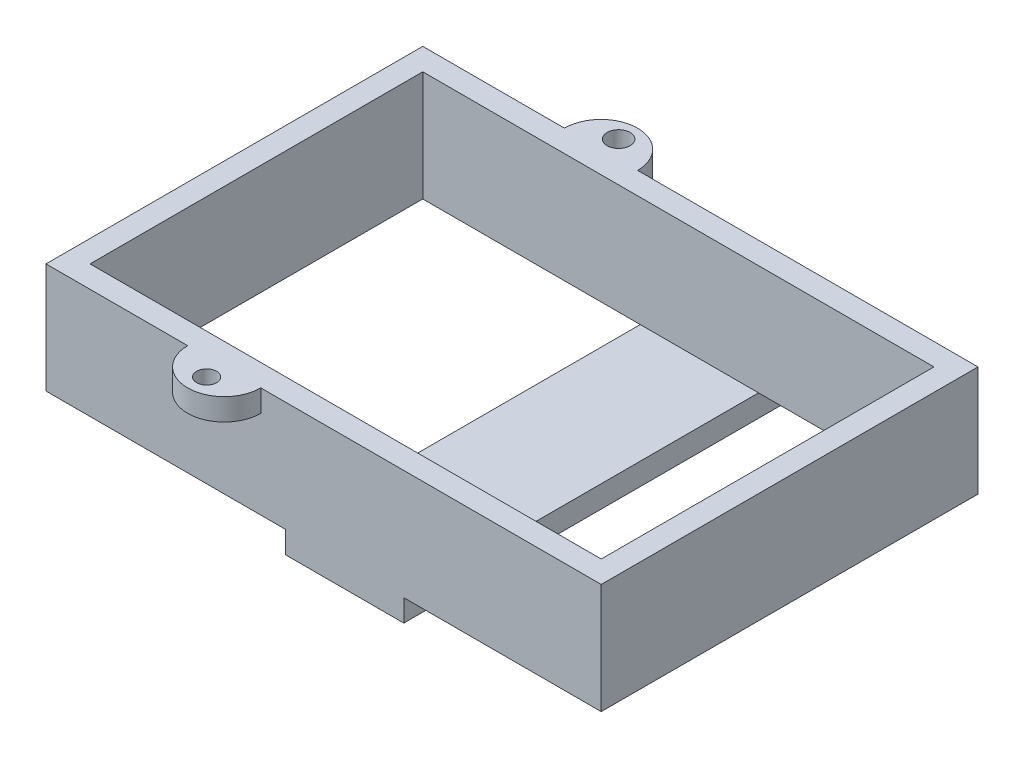
ISO-10303-21;
HEADER;
FILE_DESCRIPTION(('STEP AP214'),'2;1');
FILE_NAME('part.step','',(''),(''),'','','');
FILE_SCHEMA(('AUTOMOTIVE_DESIGN { 1 0 10303 214 1 1 1 1 }'));
ENDSEC;
DATA;
#1=APPLICATION_CONTEXT('core data for automotive mechanical design processes');
#2=APPLICATION_PROTOCOL_DEFINITION('international standard','automotive_design',2000,#1);
#3=PRODUCT_CONTEXT('',#1,'mechanical');
#4=PRODUCT('Part','Part','',(#3));
#5=PRODUCT_RELATED_PRODUCT_CATEGORY('part','',(#4));
#6=PRODUCT_DEFINITION_FORMATION('','',#4);
#7=PRODUCT_DEFINITION_CONTEXT('part definition',#1,'design');
#8=PRODUCT_DEFINITION('design','',#6,#7);
#9=PRODUCT_DEFINITION_SHAPE('','',#8);
#10=(LENGTH_UNIT() NAMED_UNIT(*) SI_UNIT(.MILLI.,.METRE.));
#11=(NAMED_UNIT(*) PLANE_ANGLE_UNIT() SI_UNIT($,.RADIAN.));
#12=(NAMED_UNIT(*) SI_UNIT($,.STERADIAN.) SOLID_ANGLE_UNIT());
#13=UNCERTAINTY_MEASURE_WITH_UNIT(LENGTH_MEASURE(1.E-05),#10,'distance_accuracy_value','');
#14=(GEOMETRIC_REPRESENTATION_CONTEXT(3) GLOBAL_UNCERTAINTY_ASSIGNED_CONTEXT((#13)) GLOBAL_UNIT_ASSIGNED_CONTEXT((#10,
#11,#12)) REPRESENTATION_CONTEXT('',''));
#15=CARTESIAN_POINT('',(0.,0.,0.));
#16=DIRECTION('',(0.,0.,1.));
#17=DIRECTION('',(1.,0.,0.));
#18=AXIS2_PLACEMENT_3D('',#15,#16,#17);
#19=CARTESIAN_POINT('',(-34.5888235294118,-12.7,21.9336470588235));
#20=DIRECTION('',(0.,0.,1.));
#21=DIRECTION('',(1.,0.,0.));
#22=AXIS2_PLACEMENT_3D('',#19,#20,#21);
#23=PLANE('',#22);
#24=DIRECTION('',(1.,0.,0.));
#25=VECTOR('',#24,1.);
#26=CARTESIAN_POINT('',(-34.5888235294118,0.,21.9336470588235));
#27=LINE('',#26,#25);
#28=CARTESIAN_POINT('',(-9.82382352941177,0.,21.9336470588235));
#29=VERTEX_POINT('',#28);
#30=CARTESIAN_POINT('',(29.4191764705882,0.,21.9336470588235));
#31=VERTEX_POINT('',#30);
#32=EDGE_CURVE('E177',#29,#31,#27,.T.);
#33=ORIENTED_EDGE('',*,*,#32,.F.);
#34=DIRECTION('',(0.,1.,0.));
#35=VECTOR('',#34,1.);
#36=CARTESIAN_POINT('',(-9.82382352941177,-2.54,21.9336470588235));
#37=LINE('',#36,#35);
#38=CARTESIAN_POINT('',(-9.82382352941177,-2.54,21.9336470588235));
#39=VERTEX_POINT('',#38);
#40=EDGE_CURVE('E168',#39,#29,#37,.T.);
#41=ORIENTED_EDGE('',*,*,#40,.F.);
#42=DIRECTION('',(1.,0.,0.));
#43=VECTOR('',#42,1.);
#44=CARTESIAN_POINT('',(0.,-2.54,21.9336470588235));
#45=LINE('',#44,#43);
#46=CARTESIAN_POINT('',(-18.2559175655999,-2.54,21.9336470588235));
#47=VERTEX_POINT('',#46);
#48=EDGE_CURVE('E160',#47,#39,#45,.T.);
#49=ORIENTED_EDGE('',*,*,#48,.F.);
#50=DIRECTION('',(0.,1.,0.));
#51=VECTOR('',#50,1.);
#52=CARTESIAN_POINT('',(-18.2559175655999,-2.54,21.9336470588235));
#53=LINE('',#52,#51);
#54=CARTESIAN_POINT('',(-18.2559175655999,0.,21.9336470588235));
#55=VERTEX_POINT('',#54);
#56=EDGE_CURVE('E173',#47,#55,#53,.T.);
#57=ORIENTED_EDGE('',*,*,#56,.T.);
#58=CARTESIAN_POINT('',(-34.5888235294118,0.,21.9336470588235));
#59=VERTEX_POINT('',#58);
#60=EDGE_CURVE('E291',#59,#55,#27,.T.);
#61=ORIENTED_EDGE('',*,*,#60,.F.);
#62=DIRECTION('',(0.,1.,0.));
#63=VECTOR('',#62,1.);
#64=CARTESIAN_POINT('',(-34.5888235294118,-12.7,21.9336470588235));
#65=LINE('',#64,#63);
#66=CARTESIAN_POINT('',(-34.5888235294118,-12.7,21.9336470588235));
#67=VERTEX_POINT('',#66);
#68=EDGE_CURVE('E304',#67,#59,#65,.T.);
#69=ORIENTED_EDGE('',*,*,#68,.F.);
#70=DIRECTION('',(1.,0.,0.));
#71=VECTOR('',#70,1.);
#72=CARTESIAN_POINT('',(-34.5888235294118,-12.7,21.9336470588235));
#73=LINE('',#72,#71);
#74=CARTESIAN_POINT('',(-6.9775294117647,-12.7,21.9336470588235));
#75=VERTEX_POINT('',#74);
#76=EDGE_CURVE('E279',#67,#75,#73,.T.);
#77=ORIENTED_EDGE('',*,*,#76,.T.);
#78=DIRECTION('',(0.,1.,0.));
#79=VECTOR('',#78,1.);
#80=CARTESIAN_POINT('',(-6.9775294117647,-15.24,21.9336470588235));
#81=LINE('',#80,#79);
#82=CARTESIAN_POINT('',(-6.9775294117647,-15.24,21.9336470588235));
#83=VERTEX_POINT('',#82);
#84=EDGE_CURVE('E232',#83,#75,#81,.T.);
#85=ORIENTED_EDGE('',*,*,#84,.F.);
#86=DIRECTION('',(-1.,0.,0.));
#87=VECTOR('',#86,1.);
#88=CARTESIAN_POINT('',(6.66077647058824,-15.24,21.9336470588235));
#89=LINE('',#88,#87);
#90=CARTESIAN_POINT('',(6.66077647058824,-15.24,21.9336470588235));
#91=VERTEX_POINT('',#90);
#92=EDGE_CURVE('E202',#91,#83,#89,.T.);
#93=ORIENTED_EDGE('',*,*,#92,.F.);
#94=DIRECTION('',(0.,1.,0.));
#95=VECTOR('',#94,1.);
#96=CARTESIAN_POINT('',(6.66077647058824,-15.24,21.9336470588235));
#97=LINE('',#96,#95);
#98=CARTESIAN_POINT('',(6.66077647058824,-12.7,21.9336470588235));
#99=VERTEX_POINT('',#98);
#100=EDGE_CURVE('E235',#91,#99,#97,.T.);
#101=ORIENTED_EDGE('',*,*,#100,.T.);
#102=CARTESIAN_POINT('',(29.4191764705882,-12.7,21.9336470588235));
#103=VERTEX_POINT('',#102);
#104=EDGE_CURVE('E270',#99,#103,#73,.T.);
#105=ORIENTED_EDGE('',*,*,#104,.T.);
#106=DIRECTION('',(0.,1.,0.));
#107=VECTOR('',#106,1.);
#108=CARTESIAN_POINT('',(29.4191764705882,-12.7,21.9336470588235));
#109=LINE('',#108,#107);
#110=EDGE_CURVE('E303',#103,#31,#109,.T.);
#111=ORIENTED_EDGE('',*,*,#110,.T.);
#112=EDGE_LOOP('',(#33,#41,#49,#57,#61,#69,#77,#85,#93,#101,#105,#111));
#113=FACE_BOUND('',#112,.T.);
#114=ADVANCED_FACE('F35',(#113),#23,.T.);
#115=CARTESIAN_POINT('',(-34.5888235294118,-12.7,-21.5003529411765));
#116=DIRECTION('',(0.,0.,-1.));
#117=DIRECTION('',(-1.,0.,0.));
#118=AXIS2_PLACEMENT_3D('',#115,#116,#117);
#119=PLANE('',#118);
#120=DIRECTION('',(-1.,0.,0.));
#121=VECTOR('',#120,1.);
#122=CARTESIAN_POINT('',(-34.5888235294118,0.,-21.5003529411765));
#123=LINE('',#122,#121);
#124=CARTESIAN_POINT('',(-18.2559175655999,0.,-21.5003529411765));
#125=VERTEX_POINT('',#124);
#126=CARTESIAN_POINT('',(-34.5888235294118,0.,-21.5003529411765));
#127=VERTEX_POINT('',#126);
#128=EDGE_CURVE('E296',#125,#127,#123,.T.);
#129=ORIENTED_EDGE('',*,*,#128,.F.);
#130=DIRECTION('',(0.,1.,0.));
#131=VECTOR('',#130,1.);
#132=CARTESIAN_POINT('',(-18.2559175655999,-2.54,-21.5003529411765));
#133=LINE('',#132,#131);
#134=CARTESIAN_POINT('',(-18.2559175655999,-2.54,-21.5003529411765));
#135=VERTEX_POINT('',#134);
#136=EDGE_CURVE('E190',#135,#125,#133,.T.);
#137=ORIENTED_EDGE('',*,*,#136,.F.);
#138=DIRECTION('',(-1.,0.,0.));
#139=VECTOR('',#138,1.);
#140=CARTESIAN_POINT('',(0.,-2.54,-21.5003529411765));
#141=LINE('',#140,#139);
#142=CARTESIAN_POINT('',(-9.82382352941177,-2.54,-21.5003529411765));
#143=VERTEX_POINT('',#142);
#144=EDGE_CURVE('E188',#143,#135,#141,.T.);
#145=ORIENTED_EDGE('',*,*,#144,.F.);
#146=DIRECTION('',(0.,1.,0.));
#147=VECTOR('',#146,1.);
#148=CARTESIAN_POINT('',(-9.82382352941177,-2.54,-21.5003529411765));
#149=LINE('',#148,#147);
#150=CARTESIAN_POINT('',(-9.82382352941177,0.,-21.5003529411765));
#151=VERTEX_POINT('',#150);
#152=EDGE_CURVE('E194',#143,#151,#149,.T.);
#153=ORIENTED_EDGE('',*,*,#152,.T.);
#154=CARTESIAN_POINT('',(29.4191764705882,0.,-21.5003529411765));
#155=VERTEX_POINT('',#154);
#156=EDGE_CURVE('E271',#155,#151,#123,.T.);
#157=ORIENTED_EDGE('',*,*,#156,.F.);
#158=DIRECTION('',(0.,1.,0.));
#159=VECTOR('',#158,1.);
#160=CARTESIAN_POINT('',(29.4191764705882,-12.7,-21.5003529411765));
#161=LINE('',#160,#159);
#162=CARTESIAN_POINT('',(29.4191764705882,-12.7,-21.5003529411765));
#163=VERTEX_POINT('',#162);
#164=EDGE_CURVE('E301',#163,#155,#161,.T.);
#165=ORIENTED_EDGE('',*,*,#164,.F.);
#166=DIRECTION('',(-1.,0.,0.));
#167=VECTOR('',#166,1.);
#168=CARTESIAN_POINT('',(-34.5888235294118,-12.7,-21.5003529411765));
#169=LINE('',#168,#167);
#170=CARTESIAN_POINT('',(6.66077647058824,-12.7,-21.5003529411765));
#171=VERTEX_POINT('',#170);
#172=EDGE_CURVE('E284',#163,#171,#169,.T.);
#173=ORIENTED_EDGE('',*,*,#172,.T.);
#174=DIRECTION('',(0.,1.,0.));
#175=VECTOR('',#174,1.);
#176=CARTESIAN_POINT('',(6.66077647058824,-15.24,-21.5003529411765));
#177=LINE('',#176,#175);
#178=CARTESIAN_POINT('',(6.66077647058824,-15.24,-21.5003529411765));
#179=VERTEX_POINT('',#178);
#180=EDGE_CURVE('E209',#179,#171,#177,.T.);
#181=ORIENTED_EDGE('',*,*,#180,.F.);
#182=DIRECTION('',(1.,0.,0.));
#183=VECTOR('',#182,1.);
#184=CARTESIAN_POINT('',(6.66077647058824,-15.24,-21.5003529411765));
#185=LINE('',#184,#183);
#186=CARTESIAN_POINT('',(-6.9775294117647,-15.24,-21.5003529411765));
#187=VERTEX_POINT('',#186);
#188=EDGE_CURVE('E207',#187,#179,#185,.T.);
#189=ORIENTED_EDGE('',*,*,#188,.F.);
#190=DIRECTION('',(0.,1.,0.));
#191=VECTOR('',#190,1.);
#192=CARTESIAN_POINT('',(-6.9775294117647,-15.24,-21.5003529411765));
#193=LINE('',#192,#191);
#194=CARTESIAN_POINT('',(-6.9775294117647,-12.7,-21.5003529411765));
#195=VERTEX_POINT('',#194);
#196=EDGE_CURVE('E227',#187,#195,#193,.T.);
#197=ORIENTED_EDGE('',*,*,#196,.T.);
#198=CARTESIAN_POINT('',(-34.5888235294118,-12.7,-21.5003529411765));
#199=VERTEX_POINT('',#198);
#200=EDGE_CURVE('E282',#195,#199,#169,.T.);
#201=ORIENTED_EDGE('',*,*,#200,.T.);
#202=DIRECTION('',(0.,1.,0.));
#203=VECTOR('',#202,1.);
#204=CARTESIAN_POINT('',(-34.5888235294118,-12.7,-21.5003529411765));
#205=LINE('',#204,#203);
#206=EDGE_CURVE('E298',#199,#127,#205,.T.);
#207=ORIENTED_EDGE('',*,*,#206,.T.);
#208=EDGE_LOOP('',(#129,#137,#145,#153,#157,#165,#173,#181,#189,#197,#201,#207));
#209=FACE_BOUND('',#208,.T.);
#210=ADVANCED_FACE('F313',(#209),#119,.T.);
#211=CARTESIAN_POINT('',(0.,-12.7,0.));
#212=DIRECTION('',(0.,1.,0.));
#213=DIRECTION('',(0.,0.,1.));
#214=AXIS2_PLACEMENT_3D('',#211,#212,#213);
#215=PLANE('',#214);
#216=DIRECTION('',(0.,0.,1.));
#217=VECTOR('',#216,1.);
#218=CARTESIAN_POINT('',(6.66077647058824,-12.7,21.9336470588235));
#219=LINE('',#218,#217);
#220=CARTESIAN_POINT('',(6.66077647058824,-12.7,-18.9603529411765));
#221=VERTEX_POINT('',#220);
#222=EDGE_CURVE('E213',#171,#221,#219,.T.);
#223=ORIENTED_EDGE('',*,*,#222,.F.);
#224=ORIENTED_EDGE('',*,*,#172,.F.);
#225=DIRECTION('',(0.,0.,-1.));
#226=VECTOR('',#225,1.);
#227=CARTESIAN_POINT('',(29.4191764705882,-12.7,-21.5003529411765));
#228=LINE('',#227,#226);
#229=EDGE_CURVE('E274',#103,#163,#228,.T.);
#230=ORIENTED_EDGE('',*,*,#229,.F.);
#231=ORIENTED_EDGE('',*,*,#104,.F.);
#232=CARTESIAN_POINT('',(6.66077647058823,-12.7,19.3936470588235));
#233=VERTEX_POINT('',#232);
#234=EDGE_CURVE('E11',#233,#99,#219,.T.);
#235=ORIENTED_EDGE('',*,*,#234,.F.);
#236=DIRECTION('',(1.,0.,0.));
#237=VECTOR('',#236,1.);
#238=CARTESIAN_POINT('',(-32.0488235294118,-12.7,19.3936470588235));
#239=LINE('',#238,#237);
#240=CARTESIAN_POINT('',(26.8791764705882,-12.7,19.3936470588235));
#241=VERTEX_POINT('',#240);
#242=EDGE_CURVE('E371',#233,#241,#239,.T.);
#243=ORIENTED_EDGE('',*,*,#242,.T.);
#244=DIRECTION('',(0.,0.,-1.));
#245=VECTOR('',#244,1.);
#246=CARTESIAN_POINT('',(26.8791764705882,-12.7,-18.9603529411765));
#247=LINE('',#246,#245);
#248=CARTESIAN_POINT('',(26.8791764705882,-12.7,-18.9603529411765));
#249=VERTEX_POINT('',#248);
#250=EDGE_CURVE('E348',#241,#249,#247,.T.);
#251=ORIENTED_EDGE('',*,*,#250,.T.);
#252=DIRECTION('',(-1.,0.,0.));
#253=VECTOR('',#252,1.);
#254=CARTESIAN_POINT('',(-32.0488235294118,-12.7,-18.9603529411765));
#255=LINE('',#254,#253);
#256=EDGE_CURVE('E249',#249,#221,#255,.T.);
#257=ORIENTED_EDGE('',*,*,#256,.T.);
#258=EDGE_LOOP('',(#223,#224,#230,#231,#235,#243,#251,#257));
#259=FACE_BOUND('',#258,.T.);
#260=ADVANCED_FACE('F354',(#259),#215,.F.);
#261=DIRECTION('',(0.,0.,-1.));
#262=VECTOR('',#261,1.);
#263=CARTESIAN_POINT('',(-6.9775294117647,-12.7,21.9336470588235));
#264=LINE('',#263,#262);
#265=CARTESIAN_POINT('',(-6.9775294117647,-12.7,19.3936470588235));
#266=VERTEX_POINT('',#265);
#267=EDGE_CURVE('E203',#75,#266,#264,.T.);
#268=ORIENTED_EDGE('',*,*,#267,.F.);
#269=ORIENTED_EDGE('',*,*,#76,.F.);
#270=DIRECTION('',(0.,0.,1.));
#271=VECTOR('',#270,1.);
#272=CARTESIAN_POINT('',(-34.5888235294118,-12.7,-21.5003529411765));
#273=LINE('',#272,#271);
#274=EDGE_CURVE('E267',#199,#67,#273,.T.);
#275=ORIENTED_EDGE('',*,*,#274,.F.);
#276=ORIENTED_EDGE('',*,*,#200,.F.);
#277=CARTESIAN_POINT('',(-6.9775294117647,-12.7,-18.9603529411765));
#278=VERTEX_POINT('',#277);
#279=EDGE_CURVE('E44',#278,#195,#264,.T.);
#280=ORIENTED_EDGE('',*,*,#279,.F.);
#281=CARTESIAN_POINT('',(-32.0488235294118,-12.7,-18.9603529411765));
#282=VERTEX_POINT('',#281);
#283=EDGE_CURVE('E338',#278,#282,#255,.T.);
#284=ORIENTED_EDGE('',*,*,#283,.T.);
#285=DIRECTION('',(0.,0.,1.));
#286=VECTOR('',#285,1.);
#287=CARTESIAN_POINT('',(-32.0488235294118,-12.7,-18.9603529411765));
#288=LINE('',#287,#286);
#289=CARTESIAN_POINT('',(-32.0488235294118,-12.7,19.3936470588235));
#290=VERTEX_POINT('',#289);
#291=EDGE_CURVE('E257',#282,#290,#288,.T.);
#292=ORIENTED_EDGE('',*,*,#291,.T.);
#293=EDGE_CURVE('E369',#290,#266,#239,.T.);
#294=ORIENTED_EDGE('',*,*,#293,.T.);
#295=EDGE_LOOP('',(#268,#269,#275,#276,#280,#284,#292,#294));
#296=FACE_BOUND('',#295,.T.);
#297=ADVANCED_FACE('F336',(#296),#215,.F.);
#298=CARTESIAN_POINT('',(-34.5888235294118,-12.7,-21.5003529411765));
#299=DIRECTION('',(-1.,0.,0.));
#300=DIRECTION('',(0.,0.,1.));
#301=AXIS2_PLACEMENT_3D('',#298,#299,#300);
#302=PLANE('',#301);
#303=DIRECTION('',(0.,0.,1.));
#304=VECTOR('',#303,1.);
#305=CARTESIAN_POINT('',(-34.5888235294118,0.,-21.5003529411765));
#306=LINE('',#305,#304);
#307=EDGE_CURVE('E260',#127,#59,#306,.T.);
#308=ORIENTED_EDGE('',*,*,#307,.F.);
#309=ORIENTED_EDGE('',*,*,#206,.F.);
#310=ORIENTED_EDGE('',*,*,#274,.T.);
#311=ORIENTED_EDGE('',*,*,#68,.T.);
#312=EDGE_LOOP('',(#308,#309,#310,#311));
#313=FACE_BOUND('',#312,.T.);
#314=ADVANCED_FACE('F37',(#313),#302,.T.);
#315=CARTESIAN_POINT('',(29.4191764705882,-12.7,-21.5003529411765));
#316=DIRECTION('',(1.,0.,0.));
#317=DIRECTION('',(0.,0.,-1.));
#318=AXIS2_PLACEMENT_3D('',#315,#316,#317);
#319=PLANE('',#318);
#320=DIRECTION('',(0.,0.,-1.));
#321=VECTOR('',#320,1.);
#322=CARTESIAN_POINT('',(29.4191764705882,0.,-21.5003529411765));
#323=LINE('',#322,#321);
#324=EDGE_CURVE('E293',#31,#155,#323,.T.);
#325=ORIENTED_EDGE('',*,*,#324,.F.);
#326=ORIENTED_EDGE('',*,*,#110,.F.);
#327=ORIENTED_EDGE('',*,*,#229,.T.);
#328=ORIENTED_EDGE('',*,*,#164,.T.);
#329=EDGE_LOOP('',(#325,#326,#327,#328));
#330=FACE_BOUND('',#329,.T.);
#331=ADVANCED_FACE('F377',(#330),#319,.T.);
#332=CARTESIAN_POINT('',(0.,0.,0.));
#333=DIRECTION('',(0.,1.,0.));
#334=DIRECTION('',(0.,0.,1.));
#335=AXIS2_PLACEMENT_3D('',#332,#333,#334);
#336=PLANE('',#335);
#337=DIRECTION('',(0.,0.,1.));
#338=VECTOR('',#337,1.);
#339=CARTESIAN_POINT('',(-32.0488235294118,0.,-18.9603529411765));
#340=LINE('',#339,#338);
#341=CARTESIAN_POINT('',(-32.0488235294118,0.,-18.9603529411765));
#342=VERTEX_POINT('',#341);
#343=CARTESIAN_POINT('',(-32.0488235294118,0.,19.3936470588235));
#344=VERTEX_POINT('',#343);
#345=EDGE_CURVE('E238',#342,#344,#340,.T.);
#346=ORIENTED_EDGE('',*,*,#345,.F.);
#347=DIRECTION('',(-1.,0.,0.));
#348=VECTOR('',#347,1.);
#349=CARTESIAN_POINT('',(-32.0488235294118,0.,-18.9603529411765));
#350=LINE('',#349,#348);
#351=CARTESIAN_POINT('',(26.8791764705882,0.,-18.9603529411765));
#352=VERTEX_POINT('',#351);
#353=EDGE_CURVE('E254',#352,#342,#350,.T.);
#354=ORIENTED_EDGE('',*,*,#353,.F.);
#355=DIRECTION('',(0.,0.,-1.));
#356=VECTOR('',#355,1.);
#357=CARTESIAN_POINT('',(26.8791764705882,0.,-18.9603529411765));
#358=LINE('',#357,#356);
#359=CARTESIAN_POINT('',(26.8791764705882,0.,19.3936470588235));
#360=VERTEX_POINT('',#359);
#361=EDGE_CURVE('E246',#360,#352,#358,.T.);
#362=ORIENTED_EDGE('',*,*,#361,.F.);
#363=DIRECTION('',(1.,0.,0.));
#364=VECTOR('',#363,1.);
#365=CARTESIAN_POINT('',(-32.0488235294118,0.,19.3936470588235));
#366=LINE('',#365,#364);
#367=EDGE_CURVE('E240',#344,#360,#366,.T.);
#368=ORIENTED_EDGE('',*,*,#367,.F.);
#369=EDGE_LOOP('',(#346,#354,#362,#368));
#370=FACE_BOUND('',#369,.T.);
#371=ORIENTED_EDGE('',*,*,#307,.T.);
#372=ORIENTED_EDGE('',*,*,#60,.T.);
#373=CARTESIAN_POINT('',(-14.0398705475059,0.,21.9336470588235));
#374=DIRECTION('',(0.,1.,0.));
#375=DIRECTION('',(0.,0.,1.));
#376=AXIS2_PLACEMENT_3D('',#373,#374,#375);
#377=CIRCLE('',#376,4.21604701809409);
#378=EDGE_CURVE('E52',#29,#55,#377,.F.);
#379=ORIENTED_EDGE('',*,*,#378,.F.);
#380=ORIENTED_EDGE('',*,*,#32,.T.);
#381=ORIENTED_EDGE('',*,*,#324,.T.);
#382=ORIENTED_EDGE('',*,*,#156,.T.);
#383=CARTESIAN_POINT('',(-14.0398705475059,0.,-21.5003529411765));
#384=DIRECTION('',(0.,1.,0.));
#385=DIRECTION('',(0.,0.,1.));
#386=AXIS2_PLACEMENT_3D('',#383,#384,#385);
#387=CIRCLE('',#386,4.21604701809409);
#388=EDGE_CURVE('E59',#125,#151,#387,.F.);
#389=ORIENTED_EDGE('',*,*,#388,.F.);
#390=ORIENTED_EDGE('',*,*,#128,.T.);
#391=EDGE_LOOP('',(#371,#372,#379,#380,#381,#382,#389,#390));
#392=FACE_BOUND('',#391,.T.);
#393=CARTESIAN_POINT('',(-14.0398705475059,0.,-23.5323529411765));
#394=DIRECTION('',(0.,1.,0.));
#395=DIRECTION('',(0.,0.,1.));
#396=AXIS2_PLACEMENT_3D('',#393,#394,#395);
#397=CIRCLE('',#396,1.327962252747);
#398=CARTESIAN_POINT('',(-14.0398705475059,0.,-22.2043906884295));
#399=VERTEX_POINT('',#398);
#400=EDGE_CURVE('E179',#399,#399,#397,.T.);
#401=ORIENTED_EDGE('',*,*,#400,.F.);
#402=EDGE_LOOP('',(#401));
#403=FACE_BOUND('',#402,.T.);
#404=CARTESIAN_POINT('',(-14.0398705475059,0.,23.9656470588235));
#405=DIRECTION('',(0.,1.,0.));
#406=DIRECTION('',(0.,0.,1.));
#407=AXIS2_PLACEMENT_3D('',#404,#405,#406);
#408=CIRCLE('',#407,1.1466599070348);
#409=CARTESIAN_POINT('',(-14.0398705475059,0.,25.1123069658583));
#410=VERTEX_POINT('',#409);
#411=EDGE_CURVE('E441',#410,#410,#408,.T.);
#412=ORIENTED_EDGE('',*,*,#411,.F.);
#413=EDGE_LOOP('',(#412));
#414=FACE_BOUND('',#413,.T.);
#415=ADVANCED_FACE('F363',(#370,#392,#403,#414),#336,.T.);
#416=CARTESIAN_POINT('',(-32.0488235294118,-12.7,-18.9603529411765));
#417=DIRECTION('',(-1.,0.,0.));
#418=DIRECTION('',(0.,0.,1.));
#419=AXIS2_PLACEMENT_3D('',#416,#417,#418);
#420=PLANE('',#419);
#421=ORIENTED_EDGE('',*,*,#345,.T.);
#422=DIRECTION('',(0.,1.,0.));
#423=VECTOR('',#422,1.);
#424=CARTESIAN_POINT('',(-32.0488235294118,-12.7,19.3936470588235));
#425=LINE('',#424,#423);
#426=EDGE_CURVE('E265',#290,#344,#425,.T.);
#427=ORIENTED_EDGE('',*,*,#426,.F.);
#428=ORIENTED_EDGE('',*,*,#291,.F.);
#429=DIRECTION('',(0.,1.,0.));
#430=VECTOR('',#429,1.);
#431=CARTESIAN_POINT('',(-32.0488235294118,-12.7,-18.9603529411765));
#432=LINE('',#431,#430);
#433=EDGE_CURVE('E258',#282,#342,#432,.T.);
#434=ORIENTED_EDGE('',*,*,#433,.T.);
#435=EDGE_LOOP('',(#421,#427,#428,#434));
#436=FACE_BOUND('',#435,.T.);
#437=ADVANCED_FACE('F370',(#436),#420,.F.);
#438=CARTESIAN_POINT('',(-32.0488235294118,-12.7,-18.9603529411765));
#439=DIRECTION('',(0.,0.,-1.));
#440=DIRECTION('',(-1.,0.,0.));
#441=AXIS2_PLACEMENT_3D('',#438,#439,#440);
#442=PLANE('',#441);
#443=ORIENTED_EDGE('',*,*,#353,.T.);
#444=ORIENTED_EDGE('',*,*,#433,.F.);
#445=ORIENTED_EDGE('',*,*,#283,.F.);
#446=EDGE_CURVE('E345',#221,#278,#255,.T.);
#447=ORIENTED_EDGE('',*,*,#446,.F.);
#448=ORIENTED_EDGE('',*,*,#256,.F.);
#449=DIRECTION('',(0.,1.,0.));
#450=VECTOR('',#449,1.);
#451=CARTESIAN_POINT('',(26.8791764705882,-12.7,-18.9603529411765));
#452=LINE('',#451,#450);
#453=EDGE_CURVE('E261',#249,#352,#452,.T.);
#454=ORIENTED_EDGE('',*,*,#453,.T.);
#455=EDGE_LOOP('',(#443,#444,#445,#447,#448,#454));
#456=FACE_BOUND('',#455,.T.);
#457=ADVANCED_FACE('F343',(#456),#442,.F.);
#458=CARTESIAN_POINT('',(26.8791764705882,-12.7,-18.9603529411765));
#459=DIRECTION('',(1.,0.,0.));
#460=DIRECTION('',(0.,0.,-1.));
#461=AXIS2_PLACEMENT_3D('',#458,#459,#460);
#462=PLANE('',#461);
#463=ORIENTED_EDGE('',*,*,#361,.T.);
#464=ORIENTED_EDGE('',*,*,#453,.F.);
#465=ORIENTED_EDGE('',*,*,#250,.F.);
#466=DIRECTION('',(0.,1.,0.));
#467=VECTOR('',#466,1.);
#468=CARTESIAN_POINT('',(26.8791764705882,-12.7,19.3936470588235));
#469=LINE('',#468,#467);
#470=EDGE_CURVE('E263',#241,#360,#469,.T.);
#471=ORIENTED_EDGE('',*,*,#470,.T.);
#472=EDGE_LOOP('',(#463,#464,#465,#471));
#473=FACE_BOUND('',#472,.T.);
#474=ADVANCED_FACE('F359',(#473),#462,.F.);
#475=CARTESIAN_POINT('',(-32.0488235294118,-12.7,19.3936470588235));
#476=DIRECTION('',(0.,0.,1.));
#477=DIRECTION('',(1.,0.,0.));
#478=AXIS2_PLACEMENT_3D('',#475,#476,#477);
#479=PLANE('',#478);
#480=ORIENTED_EDGE('',*,*,#367,.T.);
#481=ORIENTED_EDGE('',*,*,#470,.F.);
#482=ORIENTED_EDGE('',*,*,#242,.F.);
#483=EDGE_CURVE('E372',#266,#233,#239,.T.);
#484=ORIENTED_EDGE('',*,*,#483,.F.);
#485=ORIENTED_EDGE('',*,*,#293,.F.);
#486=ORIENTED_EDGE('',*,*,#426,.T.);
#487=EDGE_LOOP('',(#480,#481,#482,#484,#485,#486));
#488=FACE_BOUND('',#487,.T.);
#489=ADVANCED_FACE('F365',(#488),#479,.F.);
#490=CARTESIAN_POINT('',(6.66077647058824,-15.24,21.9336470588235));
#491=DIRECTION('',(-1.,0.,0.));
#492=DIRECTION('',(0.,0.,1.));
#493=AXIS2_PLACEMENT_3D('',#490,#491,#492);
#494=PLANE('',#493);
#495=ORIENTED_EDGE('',*,*,#222,.T.);
#496=EDGE_CURVE('E197',#221,#233,#219,.T.);
#497=ORIENTED_EDGE('',*,*,#496,.T.);
#498=ORIENTED_EDGE('',*,*,#234,.T.);
#499=ORIENTED_EDGE('',*,*,#100,.F.);
#500=DIRECTION('',(0.,0.,1.));
#501=VECTOR('',#500,1.);
#502=CARTESIAN_POINT('',(6.66077647058824,-15.24,21.9336470588235));
#503=LINE('',#502,#501);
#504=EDGE_CURVE('E199',#179,#91,#503,.T.);
#505=ORIENTED_EDGE('',*,*,#504,.F.);
#506=ORIENTED_EDGE('',*,*,#180,.T.);
#507=EDGE_LOOP('',(#495,#497,#498,#499,#505,#506));
#508=FACE_BOUND('',#507,.T.);
#509=ADVANCED_FACE('F321',(#508),#494,.F.);
#510=CARTESIAN_POINT('',(-6.9775294117647,-15.24,21.9336470588235));
#511=DIRECTION('',(1.,0.,0.));
#512=DIRECTION('',(0.,0.,-1.));
#513=AXIS2_PLACEMENT_3D('',#510,#511,#512);
#514=PLANE('',#513);
#515=ORIENTED_EDGE('',*,*,#267,.T.);
#516=EDGE_CURVE('E214',#266,#278,#264,.T.);
#517=ORIENTED_EDGE('',*,*,#516,.T.);
#518=ORIENTED_EDGE('',*,*,#279,.T.);
#519=ORIENTED_EDGE('',*,*,#196,.F.);
#520=DIRECTION('',(0.,0.,-1.));
#521=VECTOR('',#520,1.);
#522=CARTESIAN_POINT('',(-6.9775294117647,-15.24,21.9336470588235));
#523=LINE('',#522,#521);
#524=EDGE_CURVE('E205',#83,#187,#523,.T.);
#525=ORIENTED_EDGE('',*,*,#524,.F.);
#526=ORIENTED_EDGE('',*,*,#84,.T.);
#527=EDGE_LOOP('',(#515,#517,#518,#519,#525,#526));
#528=FACE_BOUND('',#527,.T.);
#529=ADVANCED_FACE('F331',(#528),#514,.F.);
#530=CARTESIAN_POINT('',(0.,-15.24,0.));
#531=DIRECTION('',(0.,1.,0.));
#532=DIRECTION('',(0.,0.,1.));
#533=AXIS2_PLACEMENT_3D('',#530,#531,#532);
#534=PLANE('',#533);
#535=ORIENTED_EDGE('',*,*,#504,.T.);
#536=ORIENTED_EDGE('',*,*,#92,.T.);
#537=ORIENTED_EDGE('',*,*,#524,.T.);
#538=ORIENTED_EDGE('',*,*,#188,.T.);
#539=EDGE_LOOP('',(#535,#536,#537,#538));
#540=FACE_BOUND('',#539,.T.);
#541=ADVANCED_FACE('F323',(#540),#534,.F.);
#542=CARTESIAN_POINT('',(0.,-12.7,0.));
#543=DIRECTION('',(0.,1.,0.));
#544=DIRECTION('',(0.,0.,1.));
#545=AXIS2_PLACEMENT_3D('',#542,#543,#544);
#546=PLANE('',#545);
#547=ORIENTED_EDGE('',*,*,#496,.F.);
#548=ORIENTED_EDGE('',*,*,#446,.T.);
#549=ORIENTED_EDGE('',*,*,#516,.F.);
#550=ORIENTED_EDGE('',*,*,#483,.T.);
#551=EDGE_LOOP('',(#547,#548,#549,#550));
#552=FACE_BOUND('',#551,.T.);
#553=ADVANCED_FACE('F351',(#552),#546,.T.);
#554=CARTESIAN_POINT('',(-14.0398705475059,-2.54,-21.5003529411765));
#555=DIRECTION('',(0.,1.,0.));
#556=DIRECTION('',(0.,0.,1.));
#557=AXIS2_PLACEMENT_3D('',#554,#555,#556);
#558=CYLINDRICAL_SURFACE('',#557,4.21604701809409);
#559=ORIENTED_EDGE('',*,*,#388,.T.);
#560=ORIENTED_EDGE('',*,*,#152,.F.);
#561=CARTESIAN_POINT('',(-14.0398705475059,-2.54,-21.5003529411765));
#562=DIRECTION('',(0.,1.,0.));
#563=DIRECTION('',(0.,0.,1.));
#564=AXIS2_PLACEMENT_3D('',#561,#562,#563);
#565=CIRCLE('',#564,4.21604701809409);
#566=EDGE_CURVE('E186',#135,#143,#565,.F.);
#567=ORIENTED_EDGE('',*,*,#566,.F.);
#568=ORIENTED_EDGE('',*,*,#136,.T.);
#569=EDGE_LOOP('',(#559,#560,#567,#568));
#570=FACE_BOUND('',#569,.T.);
#571=ADVANCED_FACE('F384',(#570),#558,.T.);
#572=CARTESIAN_POINT('',(-14.0398705475059,-2.54,-23.5323529411765));
#573=DIRECTION('',(0.,1.,0.));
#574=DIRECTION('',(0.,0.,1.));
#575=AXIS2_PLACEMENT_3D('',#572,#573,#574);
#576=CYLINDRICAL_SURFACE('',#575,1.327962252747);
#577=CARTESIAN_POINT('',(-14.0398705475059,-2.54,-23.5323529411765));
#578=DIRECTION('',(0.,1.,0.));
#579=DIRECTION('',(0.,0.,1.));
#580=AXIS2_PLACEMENT_3D('',#577,#578,#579);
#581=CIRCLE('',#580,1.327962252747);
#582=CARTESIAN_POINT('',(-14.0398705475059,-2.54,-22.2043906884295));
#583=VERTEX_POINT('',#582);
#584=EDGE_CURVE('E183',#583,#583,#581,.T.);
#585=ORIENTED_EDGE('',*,*,#584,.F.);
#586=EDGE_LOOP('',(#585));
#587=FACE_BOUND('',#586,.T.);
#588=ORIENTED_EDGE('',*,*,#400,.T.);
#589=EDGE_LOOP('',(#588));
#590=FACE_BOUND('',#589,.T.);
#591=ADVANCED_FACE('F418',(#587,#590),#576,.F.);
#592=CARTESIAN_POINT('',(0.,-2.54,0.));
#593=DIRECTION('',(0.,1.,0.));
#594=DIRECTION('',(0.,0.,1.));
#595=AXIS2_PLACEMENT_3D('',#592,#593,#594);
#596=PLANE('',#595);
#597=ORIENTED_EDGE('',*,*,#584,.T.);
#598=EDGE_LOOP('',(#597));
#599=FACE_BOUND('',#598,.T.);
#600=ORIENTED_EDGE('',*,*,#566,.T.);
#601=ORIENTED_EDGE('',*,*,#144,.T.);
#602=EDGE_LOOP('',(#600,#601));
#603=FACE_BOUND('',#602,.T.);
#604=ADVANCED_FACE('F421',(#599,#603),#596,.F.);
#605=CARTESIAN_POINT('',(-14.0398705475059,-2.54,21.9336470588235));
#606=DIRECTION('',(0.,1.,0.));
#607=DIRECTION('',(0.,0.,1.));
#608=AXIS2_PLACEMENT_3D('',#605,#606,#607);
#609=CYLINDRICAL_SURFACE('',#608,4.21604701809409);
#610=ORIENTED_EDGE('',*,*,#378,.T.);
#611=ORIENTED_EDGE('',*,*,#56,.F.);
#612=CARTESIAN_POINT('',(-14.0398705475059,-2.54,21.9336470588235));
#613=DIRECTION('',(0.,1.,0.));
#614=DIRECTION('',(0.,0.,1.));
#615=AXIS2_PLACEMENT_3D('',#612,#613,#614);
#616=CIRCLE('',#615,4.21604701809409);
#617=EDGE_CURVE('E163',#39,#47,#616,.F.);
#618=ORIENTED_EDGE('',*,*,#617,.F.);
#619=ORIENTED_EDGE('',*,*,#40,.T.);
#620=EDGE_LOOP('',(#610,#611,#618,#619));
#621=FACE_BOUND('',#620,.T.);
#622=ADVANCED_FACE('F171',(#621),#609,.T.);
#623=CARTESIAN_POINT('',(-14.0398705475059,-2.54,23.9656470588235));
#624=DIRECTION('',(0.,1.,0.));
#625=DIRECTION('',(0.,0.,1.));
#626=AXIS2_PLACEMENT_3D('',#623,#624,#625);
#627=CYLINDRICAL_SURFACE('',#626,1.1466599070348);
#628=CARTESIAN_POINT('',(-14.0398705475059,-2.54,23.9656470588235));
#629=DIRECTION('',(0.,1.,0.));
#630=DIRECTION('',(0.,0.,1.));
#631=AXIS2_PLACEMENT_3D('',#628,#629,#630);
#632=CIRCLE('',#631,1.1466599070348);
#633=CARTESIAN_POINT('',(-14.0398705475059,-2.54,25.1123069658583));
#634=VERTEX_POINT('',#633);
#635=EDGE_CURVE('E174',#634,#634,#632,.T.);
#636=ORIENTED_EDGE('',*,*,#635,.F.);
#637=EDGE_LOOP('',(#636));
#638=FACE_BOUND('',#637,.T.);
#639=ORIENTED_EDGE('',*,*,#411,.T.);
#640=EDGE_LOOP('',(#639));
#641=FACE_BOUND('',#640,.T.);
#642=ADVANCED_FACE('F428',(#638,#641),#627,.F.);
#643=CARTESIAN_POINT('',(0.,-2.54,0.));
#644=DIRECTION('',(0.,1.,0.));
#645=DIRECTION('',(0.,0.,1.));
#646=AXIS2_PLACEMENT_3D('',#643,#644,#645);
#647=PLANE('',#646);
#648=ORIENTED_EDGE('',*,*,#635,.T.);
#649=EDGE_LOOP('',(#648));
#650=FACE_BOUND('',#649,.T.);
#651=ORIENTED_EDGE('',*,*,#617,.T.);
#652=ORIENTED_EDGE('',*,*,#48,.T.);
#653=EDGE_LOOP('',(#651,#652));
#654=FACE_BOUND('',#653,.T.);
#655=ADVANCED_FACE('F162',(#650,#654),#647,.F.);
#656=CLOSED_SHELL('',(#114,#210,#260,#297,#314,#331,#415,#437,#457,#474,#489,#509,#529,#541,
#553,#571,#591,#604,#622,#642,#655));
#657=MANIFOLD_SOLID_BREP('B2',#656);
#658=ADVANCED_BREP_SHAPE_REPRESENTATION('',(#18,#657),#14);
#659=SHAPE_DEFINITION_REPRESENTATION(#9,#658);
ENDSEC;
END-ISO-10303-21;
